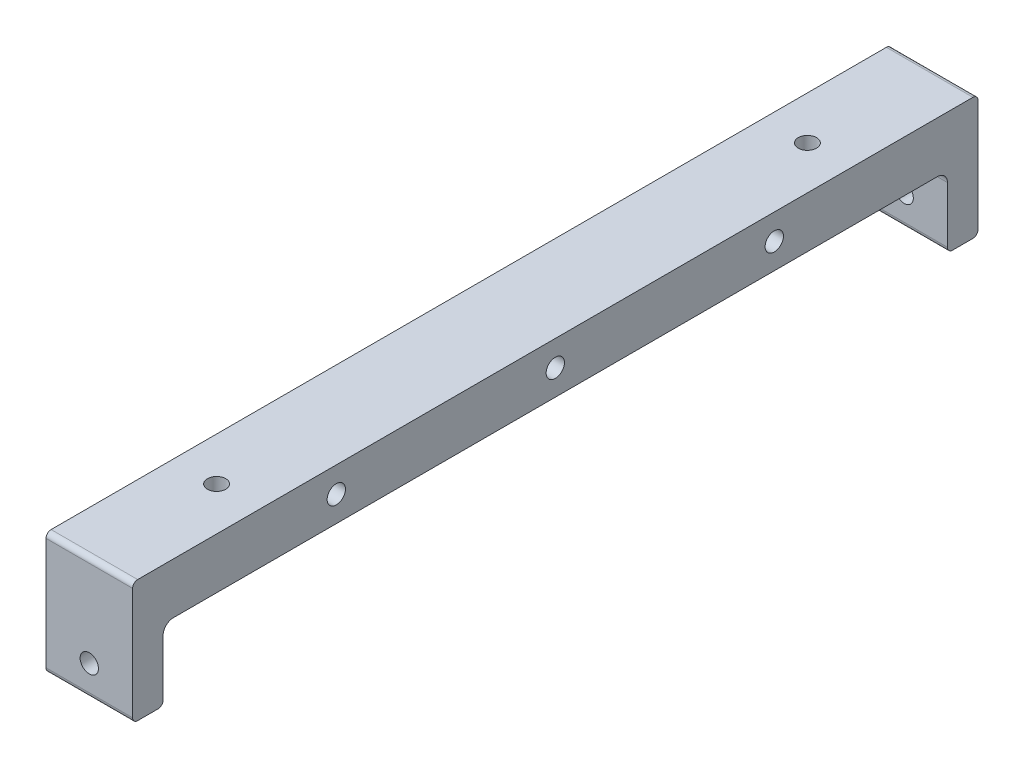
ISO-10303-21;
HEADER;
FILE_DESCRIPTION(('STEP AP214'),'2;1');
FILE_NAME('part.step','',(''),(''),'','','');
FILE_SCHEMA(('AUTOMOTIVE_DESIGN { 1 0 10303 214 1 1 1 1 }'));
ENDSEC;
DATA;
#1=APPLICATION_CONTEXT('core data for automotive mechanical design processes');
#2=APPLICATION_PROTOCOL_DEFINITION('international standard','automotive_design',2000,#1);
#3=PRODUCT_CONTEXT('',#1,'mechanical');
#4=PRODUCT('Part','Part','',(#3));
#5=PRODUCT_RELATED_PRODUCT_CATEGORY('part','',(#4));
#6=PRODUCT_DEFINITION_FORMATION('','',#4);
#7=PRODUCT_DEFINITION_CONTEXT('part definition',#1,'design');
#8=PRODUCT_DEFINITION('design','',#6,#7);
#9=PRODUCT_DEFINITION_SHAPE('','',#8);
#10=(LENGTH_UNIT() NAMED_UNIT(*) SI_UNIT(.MILLI.,.METRE.));
#11=(NAMED_UNIT(*) PLANE_ANGLE_UNIT() SI_UNIT($,.RADIAN.));
#12=(NAMED_UNIT(*) SI_UNIT($,.STERADIAN.) SOLID_ANGLE_UNIT());
#13=UNCERTAINTY_MEASURE_WITH_UNIT(LENGTH_MEASURE(1.E-05),#10,'distance_accuracy_value','');
#14=(GEOMETRIC_REPRESENTATION_CONTEXT(3) GLOBAL_UNCERTAINTY_ASSIGNED_CONTEXT((#13)) GLOBAL_UNIT_ASSIGNED_CONTEXT((#10,
#11,#12)) REPRESENTATION_CONTEXT('',''));
#15=CARTESIAN_POINT('',(0.,0.,0.));
#16=DIRECTION('',(0.,0.,1.));
#17=DIRECTION('',(1.,0.,0.));
#18=AXIS2_PLACEMENT_3D('',#15,#16,#17);
#19=CARTESIAN_POINT('',(-4.25,-6.,41.5));
#20=DIRECTION('',(0.,1.,0.));
#21=DIRECTION('',(0.,0.,1.));
#22=AXIS2_PLACEMENT_3D('',#19,#20,#21);
#23=PLANE('',#22);
#24=DIRECTION('',(0.,0.,-1.));
#25=VECTOR('',#24,1.);
#26=CARTESIAN_POINT('',(-4.25,-6.,41.5));
#27=LINE('',#26,#25);
#28=CARTESIAN_POINT('',(-4.25,-6.,41.));
#29=VERTEX_POINT('',#28);
#30=CARTESIAN_POINT('',(-4.25,-6.,39.));
#31=VERTEX_POINT('',#30);
#32=EDGE_CURVE('E280',#29,#31,#27,.T.);
#33=ORIENTED_EDGE('',*,*,#32,.T.);
#34=DIRECTION('',(1.,0.,0.));
#35=VECTOR('',#34,1.);
#36=CARTESIAN_POINT('',(-4.25,-6.,39.));
#37=LINE('',#36,#35);
#38=CARTESIAN_POINT('',(4.25,-6.,39.));
#39=VERTEX_POINT('',#38);
#40=EDGE_CURVE('E289',#31,#39,#37,.T.);
#41=ORIENTED_EDGE('',*,*,#40,.T.);
#42=DIRECTION('',(0.,0.,-1.));
#43=VECTOR('',#42,1.);
#44=CARTESIAN_POINT('',(4.25,-6.,41.5));
#45=LINE('',#44,#43);
#46=CARTESIAN_POINT('',(4.25,-6.,41.));
#47=VERTEX_POINT('',#46);
#48=EDGE_CURVE('E277',#47,#39,#45,.T.);
#49=ORIENTED_EDGE('',*,*,#48,.F.);
#50=DIRECTION('',(1.,0.,0.));
#51=VECTOR('',#50,1.);
#52=CARTESIAN_POINT('',(-4.25,-6.,41.));
#53=LINE('',#52,#51);
#54=EDGE_CURVE('E287',#47,#29,#53,.F.);
#55=ORIENTED_EDGE('',*,*,#54,.T.);
#56=EDGE_LOOP('',(#33,#41,#49,#55));
#57=FACE_BOUND('',#56,.T.);
#58=ADVANCED_FACE('F33',(#57),#23,.F.);
#59=CARTESIAN_POINT('',(4.25,-6.,41.5));
#60=DIRECTION('',(-1.,0.,0.));
#61=DIRECTION('',(0.,0.,1.));
#62=AXIS2_PLACEMENT_3D('',#59,#60,#61);
#63=PLANE('',#62);
#64=CARTESIAN_POINT('',(4.25,3.5,0.));
#65=DIRECTION('',(1.,0.,0.));
#66=DIRECTION('',(0.,0.,-1.));
#67=AXIS2_PLACEMENT_3D('',#64,#65,#66);
#68=CIRCLE('',#67,0.89999999999999);
#69=CARTESIAN_POINT('',(4.25,3.5,-0.89999999999999));
#70=VERTEX_POINT('',#69);
#71=EDGE_CURVE('E181',#70,#70,#68,.T.);
#72=ORIENTED_EDGE('',*,*,#71,.F.);
#73=EDGE_LOOP('',(#72));
#74=FACE_BOUND('',#73,.T.);
#75=CARTESIAN_POINT('',(4.25,3.5,-21.5));
#76=DIRECTION('',(-1.,0.,0.));
#77=DIRECTION('',(0.,0.,1.));
#78=AXIS2_PLACEMENT_3D('',#75,#76,#77);
#79=CIRCLE('',#78,0.899999999999998);
#80=CARTESIAN_POINT('',(4.25,3.5,-20.6));
#81=VERTEX_POINT('',#80);
#82=EDGE_CURVE('E214',#81,#81,#79,.T.);
#83=ORIENTED_EDGE('',*,*,#82,.T.);
#84=EDGE_LOOP('',(#83));
#85=FACE_BOUND('',#84,.T.);
#86=CARTESIAN_POINT('',(4.25,3.5,21.5));
#87=DIRECTION('',(-1.,0.,0.));
#88=DIRECTION('',(0.,0.,1.));
#89=AXIS2_PLACEMENT_3D('',#86,#87,#88);
#90=CIRCLE('',#89,0.899999999999998);
#91=CARTESIAN_POINT('',(4.25,3.5,22.4));
#92=VERTEX_POINT('',#91);
#93=EDGE_CURVE('E223',#92,#92,#90,.T.);
#94=ORIENTED_EDGE('',*,*,#93,.T.);
#95=EDGE_LOOP('',(#94));
#96=FACE_BOUND('',#95,.T.);
#97=ORIENTED_EDGE('',*,*,#48,.T.);
#98=CARTESIAN_POINT('',(4.25,-5.5,39.));
#99=DIRECTION('',(-1.,0.,0.));
#100=DIRECTION('',(0.,0.,1.));
#101=AXIS2_PLACEMENT_3D('',#98,#99,#100);
#102=CIRCLE('',#101,0.5);
#103=CARTESIAN_POINT('',(4.25,-5.5,38.5));
#104=VERTEX_POINT('',#103);
#105=EDGE_CURVE('E302',#39,#104,#102,.F.);
#106=ORIENTED_EDGE('',*,*,#105,.T.);
#107=DIRECTION('',(0.,-1.,0.));
#108=VECTOR('',#107,1.);
#109=CARTESIAN_POINT('',(4.25,-6.00000000000001,38.5));
#110=LINE('',#109,#108);
#111=CARTESIAN_POINT('',(4.25,0.,38.5));
#112=VERTEX_POINT('',#111);
#113=EDGE_CURVE('E230',#112,#104,#110,.T.);
#114=ORIENTED_EDGE('',*,*,#113,.F.);
#115=CARTESIAN_POINT('',(4.25,0.,37.5));
#116=DIRECTION('',(1.,0.,0.));
#117=DIRECTION('',(0.,0.,-1.));
#118=AXIS2_PLACEMENT_3D('',#115,#116,#117);
#119=CIRCLE('',#118,1.);
#120=CARTESIAN_POINT('',(4.25,1.,37.5));
#121=VERTEX_POINT('',#120);
#122=EDGE_CURVE('E250',#121,#112,#119,.T.);
#123=ORIENTED_EDGE('',*,*,#122,.F.);
#124=DIRECTION('',(0.,0.,1.));
#125=VECTOR('',#124,1.);
#126=CARTESIAN_POINT('',(4.25,1.,37.5));
#127=LINE('',#126,#125);
#128=CARTESIAN_POINT('',(4.25,1.,-37.5));
#129=VERTEX_POINT('',#128);
#130=EDGE_CURVE('E247',#129,#121,#127,.T.);
#131=ORIENTED_EDGE('',*,*,#130,.F.);
#132=CARTESIAN_POINT('',(4.25,0.,-37.5));
#133=DIRECTION('',(1.,0.,0.));
#134=DIRECTION('',(0.,0.,1.));
#135=AXIS2_PLACEMENT_3D('',#132,#133,#134);
#136=CIRCLE('',#135,1.);
#137=CARTESIAN_POINT('',(4.25,0.,-38.5));
#138=VERTEX_POINT('',#137);
#139=EDGE_CURVE('E244',#138,#129,#136,.T.);
#140=ORIENTED_EDGE('',*,*,#139,.F.);
#141=DIRECTION('',(0.,1.,0.));
#142=VECTOR('',#141,1.);
#143=CARTESIAN_POINT('',(4.25,0.,-38.5));
#144=LINE('',#143,#142);
#145=CARTESIAN_POINT('',(4.25,-5.5,-38.5));
#146=VERTEX_POINT('',#145);
#147=EDGE_CURVE('E226',#146,#138,#144,.T.);
#148=ORIENTED_EDGE('',*,*,#147,.F.);
#149=CARTESIAN_POINT('',(4.25,-5.5,-39.));
#150=DIRECTION('',(-1.,0.,0.));
#151=DIRECTION('',(0.,0.,1.));
#152=AXIS2_PLACEMENT_3D('',#149,#150,#151);
#153=CIRCLE('',#152,0.5);
#154=CARTESIAN_POINT('',(4.25,-6.,-39.));
#155=VERTEX_POINT('',#154);
#156=EDGE_CURVE('E298',#146,#155,#153,.F.);
#157=ORIENTED_EDGE('',*,*,#156,.T.);
#158=CARTESIAN_POINT('',(4.25,-6.,-41.));
#159=VERTEX_POINT('',#158);
#160=EDGE_CURVE('E271',#155,#159,#45,.T.);
#161=ORIENTED_EDGE('',*,*,#160,.T.);
#162=CARTESIAN_POINT('',(4.25,-5.5,-41.));
#163=DIRECTION('',(-1.,0.,0.));
#164=DIRECTION('',(0.,0.,1.));
#165=AXIS2_PLACEMENT_3D('',#162,#163,#164);
#166=CIRCLE('',#165,0.5);
#167=CARTESIAN_POINT('',(4.25,-5.5,-41.5));
#168=VERTEX_POINT('',#167);
#169=EDGE_CURVE('E296',#159,#168,#166,.F.);
#170=ORIENTED_EDGE('',*,*,#169,.T.);
#171=DIRECTION('',(0.,1.,0.));
#172=VECTOR('',#171,1.);
#173=CARTESIAN_POINT('',(4.25,-6.,-41.5));
#174=LINE('',#173,#172);
#175=CARTESIAN_POINT('',(4.25,5.5,-41.5));
#176=VERTEX_POINT('',#175);
#177=EDGE_CURVE('E257',#168,#176,#174,.T.);
#178=ORIENTED_EDGE('',*,*,#177,.T.);
#179=CARTESIAN_POINT('',(4.25,5.5,-41.));
#180=DIRECTION('',(-1.,0.,0.));
#181=DIRECTION('',(0.,0.,1.));
#182=AXIS2_PLACEMENT_3D('',#179,#180,#181);
#183=CIRCLE('',#182,0.5);
#184=CARTESIAN_POINT('',(4.25,6.,-41.));
#185=VERTEX_POINT('',#184);
#186=EDGE_CURVE('E292',#176,#185,#183,.F.);
#187=ORIENTED_EDGE('',*,*,#186,.T.);
#188=DIRECTION('',(0.,0.,-1.));
#189=VECTOR('',#188,1.);
#190=CARTESIAN_POINT('',(4.25,6.,41.5));
#191=LINE('',#190,#189);
#192=CARTESIAN_POINT('',(4.25,6.,41.));
#193=VERTEX_POINT('',#192);
#194=EDGE_CURVE('E284',#193,#185,#191,.T.);
#195=ORIENTED_EDGE('',*,*,#194,.F.);
#196=CARTESIAN_POINT('',(4.25,5.5,41.));
#197=DIRECTION('',(-1.,0.,0.));
#198=DIRECTION('',(0.,0.,1.));
#199=AXIS2_PLACEMENT_3D('',#196,#197,#198);
#200=CIRCLE('',#199,0.5);
#201=CARTESIAN_POINT('',(4.25,5.5,41.5));
#202=VERTEX_POINT('',#201);
#203=EDGE_CURVE('E294',#193,#202,#200,.F.);
#204=ORIENTED_EDGE('',*,*,#203,.T.);
#205=DIRECTION('',(0.,1.,0.));
#206=VECTOR('',#205,1.);
#207=CARTESIAN_POINT('',(4.25,-6.,41.5));
#208=LINE('',#207,#206);
#209=CARTESIAN_POINT('',(4.25,-5.5,41.5));
#210=VERTEX_POINT('',#209);
#211=EDGE_CURVE('E264',#210,#202,#208,.T.);
#212=ORIENTED_EDGE('',*,*,#211,.F.);
#213=CARTESIAN_POINT('',(4.25,-5.5,41.));
#214=DIRECTION('',(-1.,0.,0.));
#215=DIRECTION('',(0.,0.,1.));
#216=AXIS2_PLACEMENT_3D('',#213,#214,#215);
#217=CIRCLE('',#216,0.5);
#218=EDGE_CURVE('E300',#210,#47,#217,.F.);
#219=ORIENTED_EDGE('',*,*,#218,.T.);
#220=EDGE_LOOP('',(#97,#106,#114,#123,#131,#140,#148,#157,#161,#170,#178,#187,#195,#204,#212,#219));
#221=FACE_BOUND('',#220,.T.);
#222=ADVANCED_FACE('F356',(#74,#85,#96,#221),#63,.F.);
#223=CARTESIAN_POINT('',(-4.25,6.,41.5));
#224=DIRECTION('',(0.,-1.,0.));
#225=DIRECTION('',(0.,0.,-1.));
#226=AXIS2_PLACEMENT_3D('',#223,#224,#225);
#227=PLANE('',#226);
#228=CARTESIAN_POINT('',(0.,6.,-29.));
#229=DIRECTION('',(0.,1.,0.));
#230=DIRECTION('',(0.,0.,1.));
#231=AXIS2_PLACEMENT_3D('',#228,#229,#230);
#232=CIRCLE('',#231,0.899999999999989);
#233=CARTESIAN_POINT('',(0.,6.,-28.1));
#234=VERTEX_POINT('',#233);
#235=EDGE_CURVE('E171',#234,#234,#232,.T.);
#236=ORIENTED_EDGE('',*,*,#235,.F.);
#237=EDGE_LOOP('',(#236));
#238=FACE_BOUND('',#237,.T.);
#239=CARTESIAN_POINT('',(0.,6.,29.));
#240=DIRECTION('',(0.,1.,0.));
#241=DIRECTION('',(0.,0.,1.));
#242=AXIS2_PLACEMENT_3D('',#239,#240,#241);
#243=CIRCLE('',#242,0.899999999999989);
#244=CARTESIAN_POINT('',(0.,6.,29.9));
#245=VERTEX_POINT('',#244);
#246=EDGE_CURVE('E170',#245,#245,#243,.T.);
#247=ORIENTED_EDGE('',*,*,#246,.F.);
#248=EDGE_LOOP('',(#247));
#249=FACE_BOUND('',#248,.T.);
#250=DIRECTION('',(0.,0.,-1.));
#251=VECTOR('',#250,1.);
#252=CARTESIAN_POINT('',(-4.25,6.,41.5));
#253=LINE('',#252,#251);
#254=CARTESIAN_POINT('',(-4.25,6.,41.));
#255=VERTEX_POINT('',#254);
#256=CARTESIAN_POINT('',(-4.25,6.,-41.));
#257=VERTEX_POINT('',#256);
#258=EDGE_CURVE('E281',#255,#257,#253,.T.);
#259=ORIENTED_EDGE('',*,*,#258,.F.);
#260=DIRECTION('',(-1.,0.,0.));
#261=VECTOR('',#260,1.);
#262=CARTESIAN_POINT('',(-4.25,6.,41.));
#263=LINE('',#262,#261);
#264=EDGE_CURVE('E11',#255,#193,#263,.F.);
#265=ORIENTED_EDGE('',*,*,#264,.T.);
#266=ORIENTED_EDGE('',*,*,#194,.T.);
#267=DIRECTION('',(-1.,0.,0.));
#268=VECTOR('',#267,1.);
#269=CARTESIAN_POINT('',(-4.25,6.,-41.));
#270=LINE('',#269,#268);
#271=EDGE_CURVE('E42',#185,#257,#270,.T.);
#272=ORIENTED_EDGE('',*,*,#271,.T.);
#273=EDGE_LOOP('',(#259,#265,#266,#272));
#274=FACE_BOUND('',#273,.T.);
#275=ADVANCED_FACE('F338',(#238,#249,#274),#227,.F.);
#276=CARTESIAN_POINT('',(-4.25,-6.,41.5));
#277=DIRECTION('',(1.,0.,0.));
#278=DIRECTION('',(0.,0.,-1.));
#279=AXIS2_PLACEMENT_3D('',#276,#277,#278);
#280=PLANE('',#279);
#281=CARTESIAN_POINT('',(-4.25,3.5,-35.5));
#282=DIRECTION('',(-1.,0.,0.));
#283=DIRECTION('',(0.,0.,1.));
#284=AXIS2_PLACEMENT_3D('',#281,#282,#283);
#285=CIRCLE('',#284,0.89999999999999);
#286=CARTESIAN_POINT('',(-4.25,3.5,-34.6));
#287=VERTEX_POINT('',#286);
#288=EDGE_CURVE('E187',#287,#287,#285,.T.);
#289=ORIENTED_EDGE('',*,*,#288,.F.);
#290=EDGE_LOOP('',(#289));
#291=FACE_BOUND('',#290,.T.);
#292=CARTESIAN_POINT('',(-4.25,3.5,35.5));
#293=DIRECTION('',(-1.,0.,0.));
#294=DIRECTION('',(0.,0.,1.));
#295=AXIS2_PLACEMENT_3D('',#292,#293,#294);
#296=CIRCLE('',#295,0.89999999999999);
#297=CARTESIAN_POINT('',(-4.25,3.5,36.4));
#298=VERTEX_POINT('',#297);
#299=EDGE_CURVE('E193',#298,#298,#296,.T.);
#300=ORIENTED_EDGE('',*,*,#299,.F.);
#301=EDGE_LOOP('',(#300));
#302=FACE_BOUND('',#301,.T.);
#303=CARTESIAN_POINT('',(-4.25,3.5,-21.5));
#304=DIRECTION('',(-1.,0.,0.));
#305=DIRECTION('',(0.,0.,1.));
#306=AXIS2_PLACEMENT_3D('',#303,#304,#305);
#307=CIRCLE('',#306,1.8);
#308=CARTESIAN_POINT('',(-4.25,3.5,-19.7));
#309=VERTEX_POINT('',#308);
#310=EDGE_CURVE('E208',#309,#309,#307,.T.);
#311=ORIENTED_EDGE('',*,*,#310,.F.);
#312=EDGE_LOOP('',(#311));
#313=FACE_BOUND('',#312,.T.);
#314=CARTESIAN_POINT('',(-4.25,3.5,21.5));
#315=DIRECTION('',(-1.,0.,0.));
#316=DIRECTION('',(0.,0.,1.));
#317=AXIS2_PLACEMENT_3D('',#314,#315,#316);
#318=CIRCLE('',#317,1.8);
#319=CARTESIAN_POINT('',(-4.25,3.5,23.3));
#320=VERTEX_POINT('',#319);
#321=EDGE_CURVE('E217',#320,#320,#318,.T.);
#322=ORIENTED_EDGE('',*,*,#321,.F.);
#323=EDGE_LOOP('',(#322));
#324=FACE_BOUND('',#323,.T.);
#325=DIRECTION('',(0.,-1.,0.));
#326=VECTOR('',#325,1.);
#327=CARTESIAN_POINT('',(-4.25,-6.00000000000001,38.5));
#328=LINE('',#327,#326);
#329=CARTESIAN_POINT('',(-4.25,0.,38.5));
#330=VERTEX_POINT('',#329);
#331=CARTESIAN_POINT('',(-4.25,-5.5,38.5));
#332=VERTEX_POINT('',#331);
#333=EDGE_CURVE('E239',#330,#332,#328,.T.);
#334=ORIENTED_EDGE('',*,*,#333,.T.);
#335=CARTESIAN_POINT('',(-4.25,-5.5,39.));
#336=DIRECTION('',(1.,0.,0.));
#337=DIRECTION('',(0.,0.,-1.));
#338=AXIS2_PLACEMENT_3D('',#335,#336,#337);
#339=CIRCLE('',#338,0.5);
#340=EDGE_CURVE('E314',#332,#31,#339,.F.);
#341=ORIENTED_EDGE('',*,*,#340,.T.);
#342=ORIENTED_EDGE('',*,*,#32,.F.);
#343=CARTESIAN_POINT('',(-4.25,-5.5,41.));
#344=DIRECTION('',(1.,0.,0.));
#345=DIRECTION('',(0.,0.,-1.));
#346=AXIS2_PLACEMENT_3D('',#343,#344,#345);
#347=CIRCLE('',#346,0.5);
#348=CARTESIAN_POINT('',(-4.25,-5.5,41.5));
#349=VERTEX_POINT('',#348);
#350=EDGE_CURVE('E312',#29,#349,#347,.F.);
#351=ORIENTED_EDGE('',*,*,#350,.T.);
#352=DIRECTION('',(0.,-1.,0.));
#353=VECTOR('',#352,1.);
#354=CARTESIAN_POINT('',(-4.25,-6.,41.5));
#355=LINE('',#354,#353);
#356=CARTESIAN_POINT('',(-4.25,5.5,41.5));
#357=VERTEX_POINT('',#356);
#358=EDGE_CURVE('E267',#357,#349,#355,.T.);
#359=ORIENTED_EDGE('',*,*,#358,.F.);
#360=CARTESIAN_POINT('',(-4.25,5.5,41.));
#361=DIRECTION('',(1.,0.,0.));
#362=DIRECTION('',(0.,0.,-1.));
#363=AXIS2_PLACEMENT_3D('',#360,#361,#362);
#364=CIRCLE('',#363,0.5);
#365=EDGE_CURVE('E308',#357,#255,#364,.F.);
#366=ORIENTED_EDGE('',*,*,#365,.T.);
#367=ORIENTED_EDGE('',*,*,#258,.T.);
#368=CARTESIAN_POINT('',(-4.25,5.5,-41.));
#369=DIRECTION('',(1.,0.,0.));
#370=DIRECTION('',(0.,0.,-1.));
#371=AXIS2_PLACEMENT_3D('',#368,#369,#370);
#372=CIRCLE('',#371,0.5);
#373=CARTESIAN_POINT('',(-4.25,5.5,-41.5));
#374=VERTEX_POINT('',#373);
#375=EDGE_CURVE('E306',#257,#374,#372,.F.);
#376=ORIENTED_EDGE('',*,*,#375,.T.);
#377=DIRECTION('',(0.,-1.,0.));
#378=VECTOR('',#377,1.);
#379=CARTESIAN_POINT('',(-4.25,-6.,-41.5));
#380=LINE('',#379,#378);
#381=CARTESIAN_POINT('',(-4.25,-5.5,-41.5));
#382=VERTEX_POINT('',#381);
#383=EDGE_CURVE('E268',#374,#382,#380,.T.);
#384=ORIENTED_EDGE('',*,*,#383,.T.);
#385=CARTESIAN_POINT('',(-4.25,-5.5,-41.));
#386=DIRECTION('',(1.,0.,0.));
#387=DIRECTION('',(0.,0.,-1.));
#388=AXIS2_PLACEMENT_3D('',#385,#386,#387);
#389=CIRCLE('',#388,0.5);
#390=CARTESIAN_POINT('',(-4.25,-6.,-41.));
#391=VERTEX_POINT('',#390);
#392=EDGE_CURVE('E55',#382,#391,#389,.F.);
#393=ORIENTED_EDGE('',*,*,#392,.T.);
#394=CARTESIAN_POINT('',(-4.25,-6.,-39.));
#395=VERTEX_POINT('',#394);
#396=EDGE_CURVE('E278',#395,#391,#27,.T.);
#397=ORIENTED_EDGE('',*,*,#396,.F.);
#398=CARTESIAN_POINT('',(-4.25,-5.5,-39.));
#399=DIRECTION('',(1.,0.,0.));
#400=DIRECTION('',(0.,0.,-1.));
#401=AXIS2_PLACEMENT_3D('',#398,#399,#400);
#402=CIRCLE('',#401,0.5);
#403=CARTESIAN_POINT('',(-4.25,-5.5,-38.5));
#404=VERTEX_POINT('',#403);
#405=EDGE_CURVE('E49',#395,#404,#402,.F.);
#406=ORIENTED_EDGE('',*,*,#405,.T.);
#407=DIRECTION('',(0.,1.,0.));
#408=VECTOR('',#407,1.);
#409=CARTESIAN_POINT('',(-4.25,0.,-38.5));
#410=LINE('',#409,#408);
#411=CARTESIAN_POINT('',(-4.25,0.,-38.5));
#412=VERTEX_POINT('',#411);
#413=EDGE_CURVE('E227',#404,#412,#410,.T.);
#414=ORIENTED_EDGE('',*,*,#413,.T.);
#415=CARTESIAN_POINT('',(-4.25,0.,-37.5));
#416=DIRECTION('',(1.,0.,0.));
#417=DIRECTION('',(0.,0.,1.));
#418=AXIS2_PLACEMENT_3D('',#415,#416,#417);
#419=CIRCLE('',#418,1.);
#420=CARTESIAN_POINT('',(-4.25,1.,-37.5));
#421=VERTEX_POINT('',#420);
#422=EDGE_CURVE('E229',#412,#421,#419,.T.);
#423=ORIENTED_EDGE('',*,*,#422,.T.);
#424=DIRECTION('',(0.,0.,1.));
#425=VECTOR('',#424,1.);
#426=CARTESIAN_POINT('',(-4.25,1.,37.5));
#427=LINE('',#426,#425);
#428=CARTESIAN_POINT('',(-4.25,1.,37.5));
#429=VERTEX_POINT('',#428);
#430=EDGE_CURVE('E233',#421,#429,#427,.T.);
#431=ORIENTED_EDGE('',*,*,#430,.T.);
#432=CARTESIAN_POINT('',(-4.25,0.,37.5));
#433=DIRECTION('',(1.,0.,0.));
#434=DIRECTION('',(0.,0.,-1.));
#435=AXIS2_PLACEMENT_3D('',#432,#433,#434);
#436=CIRCLE('',#435,1.);
#437=EDGE_CURVE('E236',#429,#330,#436,.T.);
#438=ORIENTED_EDGE('',*,*,#437,.T.);
#439=EDGE_LOOP('',(#334,#341,#342,#351,#359,#366,#367,#376,#384,#393,#397,#406,#414,#423,#431,#438));
#440=FACE_BOUND('',#439,.T.);
#441=ADVANCED_FACE('F343',(#291,#302,#313,#324,#440),#280,.F.);
#442=ORIENTED_EDGE('',*,*,#160,.F.);
#443=DIRECTION('',(1.,0.,0.));
#444=VECTOR('',#443,1.);
#445=CARTESIAN_POINT('',(-4.25,-6.,-39.));
#446=LINE('',#445,#444);
#447=EDGE_CURVE('E328',#155,#395,#446,.F.);
#448=ORIENTED_EDGE('',*,*,#447,.T.);
#449=ORIENTED_EDGE('',*,*,#396,.T.);
#450=DIRECTION('',(1.,0.,0.));
#451=VECTOR('',#450,1.);
#452=CARTESIAN_POINT('',(4.25,-6.,-41.));
#453=LINE('',#452,#451);
#454=EDGE_CURVE('E325',#391,#159,#453,.T.);
#455=ORIENTED_EDGE('',*,*,#454,.T.);
#456=EDGE_LOOP('',(#442,#448,#449,#455));
#457=FACE_BOUND('',#456,.T.);
#458=ADVANCED_FACE('F368',(#457),#23,.F.);
#459=CARTESIAN_POINT('',(0.,0.,41.5));
#460=DIRECTION('',(0.,0.,-1.));
#461=DIRECTION('',(-1.,0.,0.));
#462=AXIS2_PLACEMENT_3D('',#459,#460,#461);
#463=PLANE('',#462);
#464=CARTESIAN_POINT('',(0.,-3.,41.5));
#465=DIRECTION('',(0.,0.,1.));
#466=DIRECTION('',(1.,0.,0.));
#467=AXIS2_PLACEMENT_3D('',#464,#465,#466);
#468=CIRCLE('',#467,0.899999999999989);
#469=CARTESIAN_POINT('',(0.899999999999989,-3.,41.5));
#470=VERTEX_POINT('',#469);
#471=EDGE_CURVE('E199',#470,#470,#468,.T.);
#472=ORIENTED_EDGE('',*,*,#471,.F.);
#473=EDGE_LOOP('',(#472));
#474=FACE_BOUND('',#473,.T.);
#475=ORIENTED_EDGE('',*,*,#358,.T.);
#476=DIRECTION('',(1.,0.,0.));
#477=VECTOR('',#476,1.);
#478=CARTESIAN_POINT('',(0.,-5.5,41.5));
#479=LINE('',#478,#477);
#480=EDGE_CURVE('E319',#349,#210,#479,.T.);
#481=ORIENTED_EDGE('',*,*,#480,.T.);
#482=ORIENTED_EDGE('',*,*,#211,.T.);
#483=DIRECTION('',(-1.,0.,0.));
#484=VECTOR('',#483,1.);
#485=CARTESIAN_POINT('',(0.,5.5,41.5));
#486=LINE('',#485,#484);
#487=EDGE_CURVE('E316',#202,#357,#486,.T.);
#488=ORIENTED_EDGE('',*,*,#487,.T.);
#489=EDGE_LOOP('',(#475,#481,#482,#488));
#490=FACE_BOUND('',#489,.T.);
#491=ADVANCED_FACE('F351',(#474,#490),#463,.F.);
#492=CARTESIAN_POINT('',(0.,0.,-41.5));
#493=DIRECTION('',(0.,0.,-1.));
#494=DIRECTION('',(-1.,0.,0.));
#495=AXIS2_PLACEMENT_3D('',#492,#493,#494);
#496=PLANE('',#495);
#497=CARTESIAN_POINT('',(0.,-3.,-41.5));
#498=DIRECTION('',(0.,0.,-1.));
#499=DIRECTION('',(-1.,0.,0.));
#500=AXIS2_PLACEMENT_3D('',#497,#498,#499);
#501=CIRCLE('',#500,0.899999999999982);
#502=CARTESIAN_POINT('',(-0.899999999999982,-3.,-41.5));
#503=VERTEX_POINT('',#502);
#504=EDGE_CURVE('E205',#503,#503,#501,.T.);
#505=ORIENTED_EDGE('',*,*,#504,.F.);
#506=EDGE_LOOP('',(#505));
#507=FACE_BOUND('',#506,.T.);
#508=ORIENTED_EDGE('',*,*,#177,.F.);
#509=DIRECTION('',(1.,0.,0.));
#510=VECTOR('',#509,1.);
#511=CARTESIAN_POINT('',(-4.25,-5.5,-41.5));
#512=LINE('',#511,#510);
#513=EDGE_CURVE('E332',#168,#382,#512,.F.);
#514=ORIENTED_EDGE('',*,*,#513,.T.);
#515=ORIENTED_EDGE('',*,*,#383,.F.);
#516=DIRECTION('',(-1.,0.,0.));
#517=VECTOR('',#516,1.);
#518=CARTESIAN_POINT('',(4.25,5.5,-41.5));
#519=LINE('',#518,#517);
#520=EDGE_CURVE('E330',#374,#176,#519,.F.);
#521=ORIENTED_EDGE('',*,*,#520,.T.);
#522=EDGE_LOOP('',(#508,#514,#515,#521));
#523=FACE_BOUND('',#522,.T.);
#524=ADVANCED_FACE('F361',(#507,#523),#496,.T.);
#525=CARTESIAN_POINT('',(-4.25,-6.00000000000001,38.5));
#526=DIRECTION('',(0.,0.,1.));
#527=DIRECTION('',(1.,0.,0.));
#528=AXIS2_PLACEMENT_3D('',#525,#526,#527);
#529=PLANE('',#528);
#530=CARTESIAN_POINT('',(0.,-3.,38.5));
#531=DIRECTION('',(0.,0.,1.));
#532=DIRECTION('',(1.,0.,0.));
#533=AXIS2_PLACEMENT_3D('',#530,#531,#532);
#534=CIRCLE('',#533,0.899999999999982);
#535=CARTESIAN_POINT('',(0.899999999999982,-3.,38.5));
#536=VERTEX_POINT('',#535);
#537=EDGE_CURVE('E202',#536,#536,#534,.T.);
#538=ORIENTED_EDGE('',*,*,#537,.T.);
#539=EDGE_LOOP('',(#538));
#540=FACE_BOUND('',#539,.T.);
#541=ORIENTED_EDGE('',*,*,#113,.T.);
#542=DIRECTION('',(1.,0.,0.));
#543=VECTOR('',#542,1.);
#544=CARTESIAN_POINT('',(-4.25,-5.5,38.5));
#545=LINE('',#544,#543);
#546=EDGE_CURVE('E304',#104,#332,#545,.F.);
#547=ORIENTED_EDGE('',*,*,#546,.T.);
#548=ORIENTED_EDGE('',*,*,#333,.F.);
#549=DIRECTION('',(1.,0.,0.));
#550=VECTOR('',#549,1.);
#551=CARTESIAN_POINT('',(-4.25,0.,38.5));
#552=LINE('',#551,#550);
#553=EDGE_CURVE('E255',#330,#112,#552,.T.);
#554=ORIENTED_EDGE('',*,*,#553,.T.);
#555=EDGE_LOOP('',(#541,#547,#548,#554));
#556=FACE_BOUND('',#555,.T.);
#557=ADVANCED_FACE('F401',(#540,#556),#529,.F.);
#558=CARTESIAN_POINT('',(-4.25,0.,37.5));
#559=DIRECTION('',(1.,0.,0.));
#560=DIRECTION('',(0.,0.,-1.));
#561=AXIS2_PLACEMENT_3D('',#558,#559,#560);
#562=CYLINDRICAL_SURFACE('',#561,1.);
#563=ORIENTED_EDGE('',*,*,#122,.T.);
#564=ORIENTED_EDGE('',*,*,#553,.F.);
#565=ORIENTED_EDGE('',*,*,#437,.F.);
#566=DIRECTION('',(1.,0.,0.));
#567=VECTOR('',#566,1.);
#568=CARTESIAN_POINT('',(-4.25,1.,37.5));
#569=LINE('',#568,#567);
#570=EDGE_CURVE('E258',#429,#121,#569,.T.);
#571=ORIENTED_EDGE('',*,*,#570,.T.);
#572=EDGE_LOOP('',(#563,#564,#565,#571));
#573=FACE_BOUND('',#572,.T.);
#574=ADVANCED_FACE('F388',(#573),#562,.F.);
#575=CARTESIAN_POINT('',(-4.25,1.,37.5));
#576=DIRECTION('',(0.,1.,0.));
#577=DIRECTION('',(0.,0.,1.));
#578=AXIS2_PLACEMENT_3D('',#575,#576,#577);
#579=PLANE('',#578);
#580=ORIENTED_EDGE('',*,*,#130,.T.);
#581=ORIENTED_EDGE('',*,*,#570,.F.);
#582=ORIENTED_EDGE('',*,*,#430,.F.);
#583=DIRECTION('',(1.,0.,0.));
#584=VECTOR('',#583,1.);
#585=CARTESIAN_POINT('',(-4.25,1.,-37.5));
#586=LINE('',#585,#584);
#587=EDGE_CURVE('E260',#421,#129,#586,.T.);
#588=ORIENTED_EDGE('',*,*,#587,.T.);
#589=EDGE_LOOP('',(#580,#581,#582,#588));
#590=FACE_BOUND('',#589,.T.);
#591=ADVANCED_FACE('F384',(#590),#579,.F.);
#592=CARTESIAN_POINT('',(-4.25,0.,-37.5));
#593=DIRECTION('',(1.,0.,0.));
#594=DIRECTION('',(0.,0.,-1.));
#595=AXIS2_PLACEMENT_3D('',#592,#593,#594);
#596=CYLINDRICAL_SURFACE('',#595,1.);
#597=ORIENTED_EDGE('',*,*,#139,.T.);
#598=ORIENTED_EDGE('',*,*,#587,.F.);
#599=ORIENTED_EDGE('',*,*,#422,.F.);
#600=DIRECTION('',(1.,0.,0.));
#601=VECTOR('',#600,1.);
#602=CARTESIAN_POINT('',(-4.25,0.,-38.5));
#603=LINE('',#602,#601);
#604=EDGE_CURVE('E242',#412,#138,#603,.T.);
#605=ORIENTED_EDGE('',*,*,#604,.T.);
#606=EDGE_LOOP('',(#597,#598,#599,#605));
#607=FACE_BOUND('',#606,.T.);
#608=ADVANCED_FACE('F381',(#607),#596,.F.);
#609=CARTESIAN_POINT('',(-4.25,0.,-38.5));
#610=DIRECTION('',(0.,0.,-1.));
#611=DIRECTION('',(-1.,0.,0.));
#612=AXIS2_PLACEMENT_3D('',#609,#610,#611);
#613=PLANE('',#612);
#614=CARTESIAN_POINT('',(0.,-3.,-38.5));
#615=DIRECTION('',(0.,0.,-1.));
#616=DIRECTION('',(-1.,0.,0.));
#617=AXIS2_PLACEMENT_3D('',#614,#615,#616);
#618=CIRCLE('',#617,0.899999999999982);
#619=CARTESIAN_POINT('',(-0.899999999999982,-3.,-38.5));
#620=VERTEX_POINT('',#619);
#621=EDGE_CURVE('E37',#620,#620,#618,.T.);
#622=ORIENTED_EDGE('',*,*,#621,.T.);
#623=EDGE_LOOP('',(#622));
#624=FACE_BOUND('',#623,.T.);
#625=ORIENTED_EDGE('',*,*,#413,.F.);
#626=DIRECTION('',(1.,0.,0.));
#627=VECTOR('',#626,1.);
#628=CARTESIAN_POINT('',(-4.25,-5.5,-38.5));
#629=LINE('',#628,#627);
#630=EDGE_CURVE('E322',#404,#146,#629,.T.);
#631=ORIENTED_EDGE('',*,*,#630,.T.);
#632=ORIENTED_EDGE('',*,*,#147,.T.);
#633=ORIENTED_EDGE('',*,*,#604,.F.);
#634=EDGE_LOOP('',(#625,#631,#632,#633));
#635=FACE_BOUND('',#634,.T.);
#636=ADVANCED_FACE('F376',(#624,#635),#613,.F.);
#637=CARTESIAN_POINT('',(-4.25,3.5,21.5));
#638=DIRECTION('',(-1.,0.,0.));
#639=DIRECTION('',(0.,0.,1.));
#640=AXIS2_PLACEMENT_3D('',#637,#638,#639);
#641=CYLINDRICAL_SURFACE('',#640,0.899999999999993);
#642=ORIENTED_EDGE('',*,*,#93,.F.);
#643=EDGE_LOOP('',(#642));
#644=FACE_BOUND('',#643,.T.);
#645=CARTESIAN_POINT('',(-3.34999999999999,3.5,21.5));
#646=DIRECTION('',(-1.,0.,0.));
#647=DIRECTION('',(0.,0.,1.));
#648=AXIS2_PLACEMENT_3D('',#645,#646,#647);
#649=CIRCLE('',#648,0.899999999999988);
#650=CARTESIAN_POINT('',(-3.34999999999999,3.5,22.4));
#651=VERTEX_POINT('',#650);
#652=EDGE_CURVE('E220',#651,#651,#649,.T.);
#653=ORIENTED_EDGE('',*,*,#652,.T.);
#654=EDGE_LOOP('',(#653));
#655=FACE_BOUND('',#654,.T.);
#656=ADVANCED_FACE('F476',(#644,#655),#641,.F.);
#657=CARTESIAN_POINT('',(-4.25,3.5,21.5));
#658=DIRECTION('',(-1.,0.,0.));
#659=DIRECTION('',(0.,0.,1.));
#660=AXIS2_PLACEMENT_3D('',#657,#658,#659);
#661=CONICAL_SURFACE('',#660,1.8,0.785398163397447);
#662=ORIENTED_EDGE('',*,*,#652,.F.);
#663=EDGE_LOOP('',(#662));
#664=FACE_BOUND('',#663,.T.);
#665=ORIENTED_EDGE('',*,*,#321,.T.);
#666=EDGE_LOOP('',(#665));
#667=FACE_BOUND('',#666,.T.);
#668=ADVANCED_FACE('F473',(#664,#667),#661,.F.);
#669=CARTESIAN_POINT('',(-4.25,3.5,-21.5));
#670=DIRECTION('',(-1.,0.,0.));
#671=DIRECTION('',(0.,0.,1.));
#672=AXIS2_PLACEMENT_3D('',#669,#670,#671);
#673=CYLINDRICAL_SURFACE('',#672,0.899999999999993);
#674=ORIENTED_EDGE('',*,*,#82,.F.);
#675=EDGE_LOOP('',(#674));
#676=FACE_BOUND('',#675,.T.);
#677=CARTESIAN_POINT('',(-3.34999999999999,3.5,-21.5));
#678=DIRECTION('',(-1.,0.,0.));
#679=DIRECTION('',(0.,0.,1.));
#680=AXIS2_PLACEMENT_3D('',#677,#678,#679);
#681=CIRCLE('',#680,0.899999999999988);
#682=CARTESIAN_POINT('',(-3.34999999999999,3.5,-20.6));
#683=VERTEX_POINT('',#682);
#684=EDGE_CURVE('E211',#683,#683,#681,.T.);
#685=ORIENTED_EDGE('',*,*,#684,.T.);
#686=EDGE_LOOP('',(#685));
#687=FACE_BOUND('',#686,.T.);
#688=ADVANCED_FACE('F469',(#676,#687),#673,.F.);
#689=CARTESIAN_POINT('',(-4.25,3.5,-21.5));
#690=DIRECTION('',(-1.,0.,0.));
#691=DIRECTION('',(0.,0.,1.));
#692=AXIS2_PLACEMENT_3D('',#689,#690,#691);
#693=CONICAL_SURFACE('',#692,1.8,0.785398163397447);
#694=ORIENTED_EDGE('',*,*,#684,.F.);
#695=EDGE_LOOP('',(#694));
#696=FACE_BOUND('',#695,.T.);
#697=ORIENTED_EDGE('',*,*,#310,.T.);
#698=EDGE_LOOP('',(#697));
#699=FACE_BOUND('',#698,.T.);
#700=ADVANCED_FACE('F440',(#696,#699),#693,.F.);
#701=CARTESIAN_POINT('',(-4.25,-5.5,39.));
#702=DIRECTION('',(1.,0.,0.));
#703=DIRECTION('',(0.,0.,-1.));
#704=AXIS2_PLACEMENT_3D('',#701,#702,#703);
#705=CYLINDRICAL_SURFACE('',#704,0.5);
#706=ORIENTED_EDGE('',*,*,#340,.F.);
#707=ORIENTED_EDGE('',*,*,#546,.F.);
#708=ORIENTED_EDGE('',*,*,#105,.F.);
#709=ORIENTED_EDGE('',*,*,#40,.F.);
#710=EDGE_LOOP('',(#706,#707,#708,#709));
#711=FACE_BOUND('',#710,.T.);
#712=ADVANCED_FACE('F397',(#711),#705,.T.);
#713=CARTESIAN_POINT('',(0.,-5.5,41.));
#714=DIRECTION('',(1.,0.,0.));
#715=DIRECTION('',(0.,0.,-1.));
#716=AXIS2_PLACEMENT_3D('',#713,#714,#715);
#717=CYLINDRICAL_SURFACE('',#716,0.5);
#718=ORIENTED_EDGE('',*,*,#350,.F.);
#719=ORIENTED_EDGE('',*,*,#54,.F.);
#720=ORIENTED_EDGE('',*,*,#218,.F.);
#721=ORIENTED_EDGE('',*,*,#480,.F.);
#722=EDGE_LOOP('',(#718,#719,#720,#721));
#723=FACE_BOUND('',#722,.T.);
#724=ADVANCED_FACE('F439',(#723),#717,.T.);
#725=CARTESIAN_POINT('',(-4.25,-5.5,-39.));
#726=DIRECTION('',(1.,0.,0.));
#727=DIRECTION('',(0.,0.,-1.));
#728=AXIS2_PLACEMENT_3D('',#725,#726,#727);
#729=CYLINDRICAL_SURFACE('',#728,0.5);
#730=ORIENTED_EDGE('',*,*,#405,.F.);
#731=ORIENTED_EDGE('',*,*,#447,.F.);
#732=ORIENTED_EDGE('',*,*,#156,.F.);
#733=ORIENTED_EDGE('',*,*,#630,.F.);
#734=EDGE_LOOP('',(#730,#731,#732,#733));
#735=FACE_BOUND('',#734,.T.);
#736=ADVANCED_FACE('F374',(#735),#729,.T.);
#737=CARTESIAN_POINT('',(-4.25,-5.5,-41.));
#738=DIRECTION('',(-1.,0.,0.));
#739=DIRECTION('',(0.,0.,1.));
#740=AXIS2_PLACEMENT_3D('',#737,#738,#739);
#741=CYLINDRICAL_SURFACE('',#740,0.5);
#742=ORIENTED_EDGE('',*,*,#392,.F.);
#743=ORIENTED_EDGE('',*,*,#513,.F.);
#744=ORIENTED_EDGE('',*,*,#169,.F.);
#745=ORIENTED_EDGE('',*,*,#454,.F.);
#746=EDGE_LOOP('',(#742,#743,#744,#745));
#747=FACE_BOUND('',#746,.T.);
#748=ADVANCED_FACE('F365',(#747),#741,.T.);
#749=CARTESIAN_POINT('',(0.,5.5,41.));
#750=DIRECTION('',(-1.,0.,0.));
#751=DIRECTION('',(0.,0.,1.));
#752=AXIS2_PLACEMENT_3D('',#749,#750,#751);
#753=CYLINDRICAL_SURFACE('',#752,0.5);
#754=ORIENTED_EDGE('',*,*,#203,.F.);
#755=ORIENTED_EDGE('',*,*,#264,.F.);
#756=ORIENTED_EDGE('',*,*,#365,.F.);
#757=ORIENTED_EDGE('',*,*,#487,.F.);
#758=EDGE_LOOP('',(#754,#755,#756,#757));
#759=FACE_BOUND('',#758,.T.);
#760=ADVANCED_FACE('F349',(#759),#753,.T.);
#761=CARTESIAN_POINT('',(-4.25,5.5,-41.));
#762=DIRECTION('',(1.,0.,0.));
#763=DIRECTION('',(0.,0.,-1.));
#764=AXIS2_PLACEMENT_3D('',#761,#762,#763);
#765=CYLINDRICAL_SURFACE('',#764,0.5);
#766=ORIENTED_EDGE('',*,*,#186,.F.);
#767=ORIENTED_EDGE('',*,*,#520,.F.);
#768=ORIENTED_EDGE('',*,*,#375,.F.);
#769=ORIENTED_EDGE('',*,*,#271,.F.);
#770=EDGE_LOOP('',(#766,#767,#768,#769));
#771=FACE_BOUND('',#770,.T.);
#772=ADVANCED_FACE('F35',(#771),#765,.T.);
#773=CARTESIAN_POINT('',(0.,-3.,41.5));
#774=DIRECTION('',(0.,0.,1.));
#775=DIRECTION('',(1.,0.,0.));
#776=AXIS2_PLACEMENT_3D('',#773,#774,#775);
#777=CYLINDRICAL_SURFACE('',#776,0.899999999999982);
#778=ORIENTED_EDGE('',*,*,#504,.T.);
#779=EDGE_LOOP('',(#778));
#780=FACE_BOUND('',#779,.T.);
#781=ORIENTED_EDGE('',*,*,#621,.F.);
#782=EDGE_LOOP('',(#781));
#783=FACE_BOUND('',#782,.T.);
#784=ADVANCED_FACE('F451',(#780,#783),#777,.F.);
#785=ORIENTED_EDGE('',*,*,#471,.T.);
#786=EDGE_LOOP('',(#785));
#787=FACE_BOUND('',#786,.T.);
#788=ORIENTED_EDGE('',*,*,#537,.F.);
#789=EDGE_LOOP('',(#788));
#790=FACE_BOUND('',#789,.T.);
#791=ADVANCED_FACE('F455',(#787,#790),#777,.F.);
#792=CARTESIAN_POINT('',(-1.25,3.5,35.5));
#793=DIRECTION('',(-1.,0.,0.));
#794=DIRECTION('',(0.,0.,1.));
#795=AXIS2_PLACEMENT_3D('',#792,#793,#794);
#796=CONICAL_SURFACE('',#795,0.899999999999988,1.02974425867665);
#797=CARTESIAN_POINT('',(-0.7092254428752,3.5,35.5));
#798=VERTEX_POINT('',#797);
#799=VERTEX_LOOP('',#798);
#800=FACE_BOUND('',#799,.T.);
#801=CARTESIAN_POINT('',(-1.25,3.5,35.5));
#802=DIRECTION('',(-1.,0.,0.));
#803=DIRECTION('',(0.,0.,1.));
#804=AXIS2_PLACEMENT_3D('',#801,#802,#803);
#805=CIRCLE('',#804,0.899999999999988);
#806=CARTESIAN_POINT('',(-1.25,3.5,36.4));
#807=VERTEX_POINT('',#806);
#808=EDGE_CURVE('E196',#807,#807,#805,.T.);
#809=ORIENTED_EDGE('',*,*,#808,.T.);
#810=EDGE_LOOP('',(#809));
#811=FACE_BOUND('',#810,.T.);
#812=ADVANCED_FACE('F461',(#800,#811),#796,.F.);
#813=CARTESIAN_POINT('',(-4.25,3.5,35.5));
#814=DIRECTION('',(-1.,0.,0.));
#815=DIRECTION('',(0.,0.,1.));
#816=AXIS2_PLACEMENT_3D('',#813,#814,#815);
#817=CYLINDRICAL_SURFACE('',#816,0.899999999999989);
#818=ORIENTED_EDGE('',*,*,#808,.F.);
#819=EDGE_LOOP('',(#818));
#820=FACE_BOUND('',#819,.T.);
#821=ORIENTED_EDGE('',*,*,#299,.T.);
#822=EDGE_LOOP('',(#821));
#823=FACE_BOUND('',#822,.T.);
#824=ADVANCED_FACE('F614',(#820,#823),#817,.F.);
#825=CARTESIAN_POINT('',(-1.25,3.5,-35.5));
#826=DIRECTION('',(-1.,0.,0.));
#827=DIRECTION('',(0.,0.,1.));
#828=AXIS2_PLACEMENT_3D('',#825,#826,#827);
#829=CONICAL_SURFACE('',#828,0.899999999999988,1.02974425867665);
#830=CARTESIAN_POINT('',(-0.7092254428752,3.5,-35.5));
#831=VERTEX_POINT('',#830);
#832=VERTEX_LOOP('',#831);
#833=FACE_BOUND('',#832,.T.);
#834=CARTESIAN_POINT('',(-1.25,3.5,-35.5));
#835=DIRECTION('',(-1.,0.,0.));
#836=DIRECTION('',(0.,0.,1.));
#837=AXIS2_PLACEMENT_3D('',#834,#835,#836);
#838=CIRCLE('',#837,0.899999999999988);
#839=CARTESIAN_POINT('',(-1.25,3.5,-34.6));
#840=VERTEX_POINT('',#839);
#841=EDGE_CURVE('E190',#840,#840,#838,.T.);
#842=ORIENTED_EDGE('',*,*,#841,.T.);
#843=EDGE_LOOP('',(#842));
#844=FACE_BOUND('',#843,.T.);
#845=ADVANCED_FACE('F623',(#833,#844),#829,.F.);
#846=CARTESIAN_POINT('',(-4.25,3.5,-35.5));
#847=DIRECTION('',(-1.,0.,0.));
#848=DIRECTION('',(0.,0.,1.));
#849=AXIS2_PLACEMENT_3D('',#846,#847,#848);
#850=CYLINDRICAL_SURFACE('',#849,0.899999999999989);
#851=ORIENTED_EDGE('',*,*,#841,.F.);
#852=EDGE_LOOP('',(#851));
#853=FACE_BOUND('',#852,.T.);
#854=ORIENTED_EDGE('',*,*,#288,.T.);
#855=EDGE_LOOP('',(#854));
#856=FACE_BOUND('',#855,.T.);
#857=ADVANCED_FACE('F632',(#853,#856),#850,.F.);
#858=CARTESIAN_POINT('',(1.25,3.5,0.));
#859=DIRECTION('',(1.,0.,0.));
#860=DIRECTION('',(0.,0.,-1.));
#861=AXIS2_PLACEMENT_3D('',#858,#859,#860);
#862=CONICAL_SURFACE('',#861,0.899999999999988,1.02974425867665);
#863=CARTESIAN_POINT('',(0.709225442875198,3.5,0.));
#864=VERTEX_POINT('',#863);
#865=VERTEX_LOOP('',#864);
#866=FACE_BOUND('',#865,.T.);
#867=CARTESIAN_POINT('',(1.25,3.5,0.));
#868=DIRECTION('',(1.,0.,0.));
#869=DIRECTION('',(0.,0.,-1.));
#870=AXIS2_PLACEMENT_3D('',#867,#868,#869);
#871=CIRCLE('',#870,0.899999999999988);
#872=CARTESIAN_POINT('',(1.25,3.5,-0.899999999999988));
#873=VERTEX_POINT('',#872);
#874=EDGE_CURVE('E184',#873,#873,#871,.T.);
#875=ORIENTED_EDGE('',*,*,#874,.T.);
#876=EDGE_LOOP('',(#875));
#877=FACE_BOUND('',#876,.T.);
#878=ADVANCED_FACE('F642',(#866,#877),#862,.F.);
#879=CARTESIAN_POINT('',(4.25,3.5,0.));
#880=DIRECTION('',(1.,0.,0.));
#881=DIRECTION('',(0.,0.,-1.));
#882=AXIS2_PLACEMENT_3D('',#879,#880,#881);
#883=CYLINDRICAL_SURFACE('',#882,0.899999999999989);
#884=ORIENTED_EDGE('',*,*,#874,.F.);
#885=EDGE_LOOP('',(#884));
#886=FACE_BOUND('',#885,.T.);
#887=ORIENTED_EDGE('',*,*,#71,.T.);
#888=EDGE_LOOP('',(#887));
#889=FACE_BOUND('',#888,.T.);
#890=ADVANCED_FACE('F658',(#886,#889),#883,.F.);
#891=CARTESIAN_POINT('',(0.,3.,29.));
#892=DIRECTION('',(0.,1.,0.));
#893=DIRECTION('',(0.,0.,1.));
#894=AXIS2_PLACEMENT_3D('',#891,#892,#893);
#895=CONICAL_SURFACE('',#894,0.899999999999988,1.02974425867665);
#896=CARTESIAN_POINT('',(0.,2.4592254428752,29.));
#897=VERTEX_POINT('',#896);
#898=VERTEX_LOOP('',#897);
#899=FACE_BOUND('',#898,.T.);
#900=CARTESIAN_POINT('',(0.,3.,29.));
#901=DIRECTION('',(0.,1.,0.));
#902=DIRECTION('',(0.,0.,1.));
#903=AXIS2_PLACEMENT_3D('',#900,#901,#902);
#904=CIRCLE('',#903,0.899999999999988);
#905=CARTESIAN_POINT('',(0.,3.,29.9));
#906=VERTEX_POINT('',#905);
#907=EDGE_CURVE('E174',#906,#906,#904,.T.);
#908=ORIENTED_EDGE('',*,*,#907,.T.);
#909=EDGE_LOOP('',(#908));
#910=FACE_BOUND('',#909,.T.);
#911=ADVANCED_FACE('F668',(#899,#910),#895,.F.);
#912=CARTESIAN_POINT('',(0.,6.,29.));
#913=DIRECTION('',(0.,1.,0.));
#914=DIRECTION('',(0.,0.,1.));
#915=AXIS2_PLACEMENT_3D('',#912,#913,#914);
#916=CYLINDRICAL_SURFACE('',#915,0.899999999999988);
#917=ORIENTED_EDGE('',*,*,#907,.F.);
#918=EDGE_LOOP('',(#917));
#919=FACE_BOUND('',#918,.T.);
#920=ORIENTED_EDGE('',*,*,#246,.T.);
#921=EDGE_LOOP('',(#920));
#922=FACE_BOUND('',#921,.T.);
#923=ADVANCED_FACE('F164',(#919,#922),#916,.F.);
#924=CARTESIAN_POINT('',(0.,3.,-29.));
#925=DIRECTION('',(0.,1.,0.));
#926=DIRECTION('',(0.,0.,1.));
#927=AXIS2_PLACEMENT_3D('',#924,#925,#926);
#928=CONICAL_SURFACE('',#927,0.899999999999988,1.02974425867665);
#929=CARTESIAN_POINT('',(0.,2.4592254428752,-29.));
#930=VERTEX_POINT('',#929);
#931=VERTEX_LOOP('',#930);
#932=FACE_BOUND('',#931,.T.);
#933=CARTESIAN_POINT('',(0.,3.,-29.));
#934=DIRECTION('',(0.,1.,0.));
#935=DIRECTION('',(0.,0.,1.));
#936=AXIS2_PLACEMENT_3D('',#933,#934,#935);
#937=CIRCLE('',#936,0.899999999999988);
#938=CARTESIAN_POINT('',(0.,3.,-28.1));
#939=VERTEX_POINT('',#938);
#940=EDGE_CURVE('E168',#939,#939,#937,.T.);
#941=ORIENTED_EDGE('',*,*,#940,.T.);
#942=EDGE_LOOP('',(#941));
#943=FACE_BOUND('',#942,.T.);
#944=ADVANCED_FACE('F160',(#932,#943),#928,.F.);
#945=CARTESIAN_POINT('',(0.,6.,-29.));
#946=DIRECTION('',(0.,1.,0.));
#947=DIRECTION('',(0.,0.,1.));
#948=AXIS2_PLACEMENT_3D('',#945,#946,#947);
#949=CYLINDRICAL_SURFACE('',#948,0.899999999999988);
#950=ORIENTED_EDGE('',*,*,#940,.F.);
#951=EDGE_LOOP('',(#950));
#952=FACE_BOUND('',#951,.T.);
#953=ORIENTED_EDGE('',*,*,#235,.T.);
#954=EDGE_LOOP('',(#953));
#955=FACE_BOUND('',#954,.T.);
#956=ADVANCED_FACE('F163',(#952,#955),#949,.F.);
#957=CLOSED_SHELL('',(#58,#222,#275,#441,#458,#491,#524,#557,#574,#591,#608,#636,#656,#668,#688,
#700,#712,#724,#736,#748,#760,#772,#784,#791,#812,#824,#845,#857,#878,#890,#911,#923,#944,#956));
#958=MANIFOLD_SOLID_BREP('B2',#957);
#959=ADVANCED_BREP_SHAPE_REPRESENTATION('',(#18,#958),#14);
#960=SHAPE_DEFINITION_REPRESENTATION(#9,#959);
ENDSEC;
END-ISO-10303-21;
